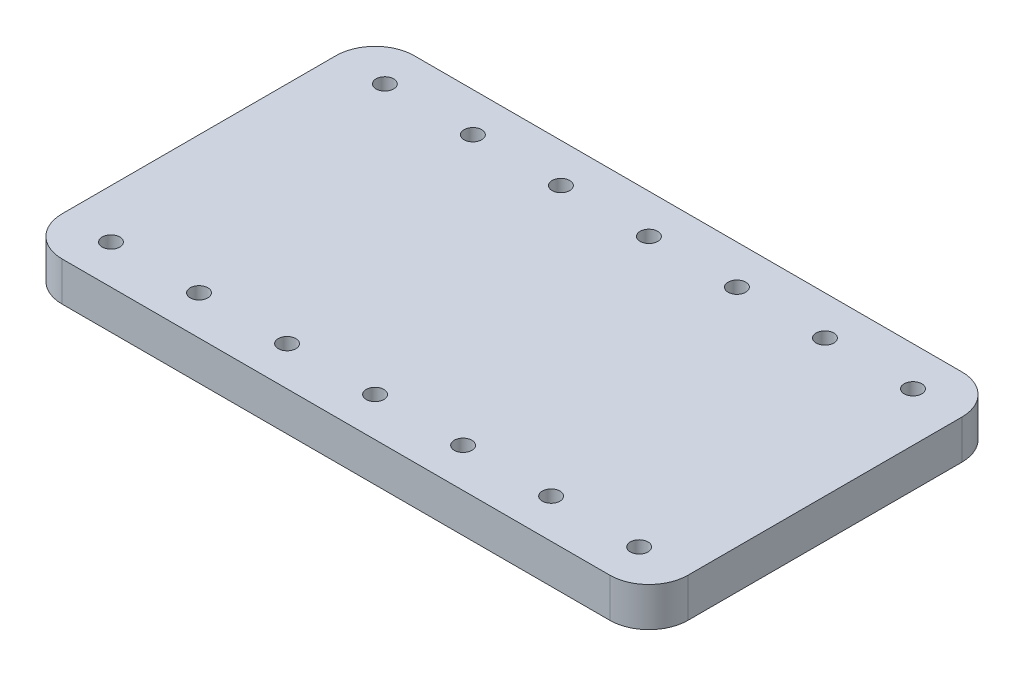
ISO-10303-21;
HEADER;
FILE_DESCRIPTION(('STEP AP214'),'2;1');
FILE_NAME('part.step','',(''),(''),'','','');
FILE_SCHEMA(('AUTOMOTIVE_DESIGN { 1 0 10303 214 1 1 1 1 }'));
ENDSEC;
DATA;
#1=APPLICATION_CONTEXT('core data for automotive mechanical design processes');
#2=APPLICATION_PROTOCOL_DEFINITION('international standard','automotive_design',2000,#1);
#3=PRODUCT_CONTEXT('',#1,'mechanical');
#4=PRODUCT('Part','Part','',(#3));
#5=PRODUCT_RELATED_PRODUCT_CATEGORY('part','',(#4));
#6=PRODUCT_DEFINITION_FORMATION('','',#4);
#7=PRODUCT_DEFINITION_CONTEXT('part definition',#1,'design');
#8=PRODUCT_DEFINITION('design','',#6,#7);
#9=PRODUCT_DEFINITION_SHAPE('','',#8);
#10=(LENGTH_UNIT() NAMED_UNIT(*) SI_UNIT(.MILLI.,.METRE.));
#11=(NAMED_UNIT(*) PLANE_ANGLE_UNIT() SI_UNIT($,.RADIAN.));
#12=(NAMED_UNIT(*) SI_UNIT($,.STERADIAN.) SOLID_ANGLE_UNIT());
#13=UNCERTAINTY_MEASURE_WITH_UNIT(LENGTH_MEASURE(1.E-05),#10,'distance_accuracy_value','');
#14=(GEOMETRIC_REPRESENTATION_CONTEXT(3) GLOBAL_UNCERTAINTY_ASSIGNED_CONTEXT((#13)) GLOBAL_UNIT_ASSIGNED_CONTEXT((#10,
#11,#12)) REPRESENTATION_CONTEXT('',''));
#15=CARTESIAN_POINT('',(0.,0.,0.));
#16=DIRECTION('',(0.,0.,1.));
#17=DIRECTION('',(1.,0.,0.));
#18=AXIS2_PLACEMENT_3D('',#15,#16,#17);
#19=CARTESIAN_POINT('',(0.,10.,0.));
#20=DIRECTION('',(0.,1.,0.));
#21=DIRECTION('',(0.,0.,1.));
#22=AXIS2_PLACEMENT_3D('',#19,#20,#21);
#23=PLANE('',#22);
#24=CARTESIAN_POINT('',(0.,10.,35.));
#25=DIRECTION('',(0.,1.,0.));
#26=DIRECTION('',(0.,0.,1.));
#27=AXIS2_PLACEMENT_3D('',#24,#25,#26);
#28=CIRCLE('',#27,2.25);
#29=CARTESIAN_POINT('',(0.,10.,37.25));
#30=VERTEX_POINT('',#29);
#31=EDGE_CURVE('E245',#30,#30,#28,.T.);
#32=ORIENTED_EDGE('',*,*,#31,.F.);
#33=EDGE_LOOP('',(#32));
#34=FACE_BOUND('',#33,.T.);
#35=CARTESIAN_POINT('',(0.,10.,-35.));
#36=DIRECTION('',(0.,1.,0.));
#37=DIRECTION('',(0.,0.,1.));
#38=AXIS2_PLACEMENT_3D('',#35,#36,#37);
#39=CIRCLE('',#38,2.25);
#40=CARTESIAN_POINT('',(0.,10.,-32.75));
#41=VERTEX_POINT('',#40);
#42=EDGE_CURVE('E233',#41,#41,#39,.T.);
#43=ORIENTED_EDGE('',*,*,#42,.F.);
#44=EDGE_LOOP('',(#43));
#45=FACE_BOUND('',#44,.T.);
#46=CARTESIAN_POINT('',(-45.,10.,-35.));
#47=DIRECTION('',(0.,1.,0.));
#48=DIRECTION('',(0.,0.,1.));
#49=AXIS2_PLACEMENT_3D('',#46,#47,#48);
#50=CIRCLE('',#49,2.25);
#51=CARTESIAN_POINT('',(-45.,10.,-32.75));
#52=VERTEX_POINT('',#51);
#53=EDGE_CURVE('E221',#52,#52,#50,.T.);
#54=ORIENTED_EDGE('',*,*,#53,.F.);
#55=EDGE_LOOP('',(#54));
#56=FACE_BOUND('',#55,.T.);
#57=CARTESIAN_POINT('',(-22.5,10.,35.));
#58=DIRECTION('',(0.,1.,0.));
#59=DIRECTION('',(0.,0.,1.));
#60=AXIS2_PLACEMENT_3D('',#57,#58,#59);
#61=CIRCLE('',#60,2.25);
#62=CARTESIAN_POINT('',(-22.5,10.,37.25));
#63=VERTEX_POINT('',#62);
#64=EDGE_CURVE('E209',#63,#63,#61,.T.);
#65=ORIENTED_EDGE('',*,*,#64,.F.);
#66=EDGE_LOOP('',(#65));
#67=FACE_BOUND('',#66,.T.);
#68=CARTESIAN_POINT('',(67.5,10.,35.));
#69=DIRECTION('',(0.,1.,0.));
#70=DIRECTION('',(0.,0.,1.));
#71=AXIS2_PLACEMENT_3D('',#68,#69,#70);
#72=CIRCLE('',#71,2.25);
#73=CARTESIAN_POINT('',(67.5,10.,37.25));
#74=VERTEX_POINT('',#73);
#75=EDGE_CURVE('E197',#74,#74,#72,.T.);
#76=ORIENTED_EDGE('',*,*,#75,.F.);
#77=EDGE_LOOP('',(#76));
#78=FACE_BOUND('',#77,.T.);
#79=CARTESIAN_POINT('',(22.5,10.,-35.));
#80=DIRECTION('',(0.,1.,0.));
#81=DIRECTION('',(0.,0.,1.));
#82=AXIS2_PLACEMENT_3D('',#79,#80,#81);
#83=CIRCLE('',#82,2.25);
#84=CARTESIAN_POINT('',(22.5,10.,-32.75));
#85=VERTEX_POINT('',#84);
#86=EDGE_CURVE('E185',#85,#85,#83,.T.);
#87=ORIENTED_EDGE('',*,*,#86,.F.);
#88=EDGE_LOOP('',(#87));
#89=FACE_BOUND('',#88,.T.);
#90=CARTESIAN_POINT('',(-22.5,10.,-35.));
#91=DIRECTION('',(0.,1.,0.));
#92=DIRECTION('',(0.,0.,1.));
#93=AXIS2_PLACEMENT_3D('',#90,#91,#92);
#94=CIRCLE('',#93,2.25);
#95=CARTESIAN_POINT('',(-22.5,10.,-32.75));
#96=VERTEX_POINT('',#95);
#97=EDGE_CURVE('E126',#96,#96,#94,.T.);
#98=ORIENTED_EDGE('',*,*,#97,.F.);
#99=EDGE_LOOP('',(#98));
#100=FACE_BOUND('',#99,.T.);
#101=DIRECTION('',(-1.,0.,0.));
#102=VECTOR('',#101,1.);
#103=CARTESIAN_POINT('',(-80.,10.,-45.));
#104=LINE('',#103,#102);
#105=CARTESIAN_POINT('',(70.,10.,-45.));
#106=VERTEX_POINT('',#105);
#107=CARTESIAN_POINT('',(-70.,10.,-45.));
#108=VERTEX_POINT('',#107);
#109=EDGE_CURVE('E135',#106,#108,#104,.T.);
#110=ORIENTED_EDGE('',*,*,#109,.T.);
#111=CARTESIAN_POINT('',(-70.,10.,-35.));
#112=DIRECTION('',(0.,1.,0.));
#113=DIRECTION('',(0.,0.,1.));
#114=AXIS2_PLACEMENT_3D('',#111,#112,#113);
#115=CIRCLE('',#114,10.);
#116=CARTESIAN_POINT('',(-80.,10.,-35.));
#117=VERTEX_POINT('',#116);
#118=EDGE_CURVE('E154',#108,#117,#115,.T.);
#119=ORIENTED_EDGE('',*,*,#118,.T.);
#120=DIRECTION('',(0.,0.,1.));
#121=VECTOR('',#120,1.);
#122=CARTESIAN_POINT('',(-80.,10.,-45.));
#123=LINE('',#122,#121);
#124=CARTESIAN_POINT('',(-80.,10.,35.));
#125=VERTEX_POINT('',#124);
#126=EDGE_CURVE('E118',#117,#125,#123,.T.);
#127=ORIENTED_EDGE('',*,*,#126,.T.);
#128=CARTESIAN_POINT('',(-70.,10.,35.));
#129=DIRECTION('',(0.,1.,0.));
#130=DIRECTION('',(0.,0.,1.));
#131=AXIS2_PLACEMENT_3D('',#128,#129,#130);
#132=CIRCLE('',#131,10.);
#133=CARTESIAN_POINT('',(-70.,10.,45.));
#134=VERTEX_POINT('',#133);
#135=EDGE_CURVE('E149',#125,#134,#132,.T.);
#136=ORIENTED_EDGE('',*,*,#135,.T.);
#137=DIRECTION('',(1.,0.,0.));
#138=VECTOR('',#137,1.);
#139=CARTESIAN_POINT('',(-80.,10.,45.));
#140=LINE('',#139,#138);
#141=CARTESIAN_POINT('',(70.,10.,45.));
#142=VERTEX_POINT('',#141);
#143=EDGE_CURVE('E165',#134,#142,#140,.T.);
#144=ORIENTED_EDGE('',*,*,#143,.T.);
#145=CARTESIAN_POINT('',(70.,10.,35.));
#146=DIRECTION('',(0.,1.,0.));
#147=DIRECTION('',(0.,0.,1.));
#148=AXIS2_PLACEMENT_3D('',#145,#146,#147);
#149=CIRCLE('',#148,10.);
#150=CARTESIAN_POINT('',(80.,10.,34.9999999999999));
#151=VERTEX_POINT('',#150);
#152=EDGE_CURVE('E54',#142,#151,#149,.T.);
#153=ORIENTED_EDGE('',*,*,#152,.T.);
#154=DIRECTION('',(0.,0.,-1.));
#155=VECTOR('',#154,1.);
#156=CARTESIAN_POINT('',(80.,10.,-45.));
#157=LINE('',#156,#155);
#158=CARTESIAN_POINT('',(80.,10.,-35.));
#159=VERTEX_POINT('',#158);
#160=EDGE_CURVE('E173',#151,#159,#157,.T.);
#161=ORIENTED_EDGE('',*,*,#160,.T.);
#162=CARTESIAN_POINT('',(70.,10.,-35.));
#163=DIRECTION('',(0.,1.,0.));
#164=DIRECTION('',(0.,0.,1.));
#165=AXIS2_PLACEMENT_3D('',#162,#163,#164);
#166=CIRCLE('',#165,10.);
#167=EDGE_CURVE('E152',#159,#106,#166,.T.);
#168=ORIENTED_EDGE('',*,*,#167,.T.);
#169=EDGE_LOOP('',(#110,#119,#127,#136,#144,#153,#161,#168));
#170=FACE_BOUND('',#169,.T.);
#171=CARTESIAN_POINT('',(-67.5,10.,-35.));
#172=DIRECTION('',(0.,1.,0.));
#173=DIRECTION('',(0.,0.,1.));
#174=AXIS2_PLACEMENT_3D('',#171,#172,#173);
#175=CIRCLE('',#174,2.25);
#176=CARTESIAN_POINT('',(-67.5,10.,-32.75));
#177=VERTEX_POINT('',#176);
#178=EDGE_CURVE('E180',#177,#177,#175,.T.);
#179=ORIENTED_EDGE('',*,*,#178,.F.);
#180=EDGE_LOOP('',(#179));
#181=FACE_BOUND('',#180,.T.);
#182=CARTESIAN_POINT('',(67.5,10.,-35.));
#183=DIRECTION('',(0.,1.,0.));
#184=DIRECTION('',(0.,0.,1.));
#185=AXIS2_PLACEMENT_3D('',#182,#183,#184);
#186=CIRCLE('',#185,2.25);
#187=CARTESIAN_POINT('',(67.5,10.,-32.75));
#188=VERTEX_POINT('',#187);
#189=EDGE_CURVE('E191',#188,#188,#186,.T.);
#190=ORIENTED_EDGE('',*,*,#189,.F.);
#191=EDGE_LOOP('',(#190));
#192=FACE_BOUND('',#191,.T.);
#193=CARTESIAN_POINT('',(22.5,10.,35.));
#194=DIRECTION('',(0.,1.,0.));
#195=DIRECTION('',(0.,0.,1.));
#196=AXIS2_PLACEMENT_3D('',#193,#194,#195);
#197=CIRCLE('',#196,2.25);
#198=CARTESIAN_POINT('',(22.5,10.,37.25));
#199=VERTEX_POINT('',#198);
#200=EDGE_CURVE('E203',#199,#199,#197,.T.);
#201=ORIENTED_EDGE('',*,*,#200,.F.);
#202=EDGE_LOOP('',(#201));
#203=FACE_BOUND('',#202,.T.);
#204=CARTESIAN_POINT('',(-67.5,10.,35.));
#205=DIRECTION('',(0.,1.,0.));
#206=DIRECTION('',(0.,0.,1.));
#207=AXIS2_PLACEMENT_3D('',#204,#205,#206);
#208=CIRCLE('',#207,2.25);
#209=CARTESIAN_POINT('',(-67.5,10.,37.25));
#210=VERTEX_POINT('',#209);
#211=EDGE_CURVE('E215',#210,#210,#208,.T.);
#212=ORIENTED_EDGE('',*,*,#211,.F.);
#213=EDGE_LOOP('',(#212));
#214=FACE_BOUND('',#213,.T.);
#215=CARTESIAN_POINT('',(45.,10.,-35.));
#216=DIRECTION('',(0.,1.,0.));
#217=DIRECTION('',(0.,0.,1.));
#218=AXIS2_PLACEMENT_3D('',#215,#216,#217);
#219=CIRCLE('',#218,2.25);
#220=CARTESIAN_POINT('',(45.,10.,-32.75));
#221=VERTEX_POINT('',#220);
#222=EDGE_CURVE('E227',#221,#221,#219,.T.);
#223=ORIENTED_EDGE('',*,*,#222,.F.);
#224=EDGE_LOOP('',(#223));
#225=FACE_BOUND('',#224,.T.);
#226=CARTESIAN_POINT('',(-45.,10.,35.));
#227=DIRECTION('',(0.,1.,0.));
#228=DIRECTION('',(0.,0.,1.));
#229=AXIS2_PLACEMENT_3D('',#226,#227,#228);
#230=CIRCLE('',#229,2.25);
#231=CARTESIAN_POINT('',(-45.,10.,37.25));
#232=VERTEX_POINT('',#231);
#233=EDGE_CURVE('E239',#232,#232,#230,.T.);
#234=ORIENTED_EDGE('',*,*,#233,.F.);
#235=EDGE_LOOP('',(#234));
#236=FACE_BOUND('',#235,.T.);
#237=CARTESIAN_POINT('',(45.,10.,35.));
#238=DIRECTION('',(0.,1.,0.));
#239=DIRECTION('',(0.,0.,1.));
#240=AXIS2_PLACEMENT_3D('',#237,#238,#239);
#241=CIRCLE('',#240,2.25);
#242=CARTESIAN_POINT('',(45.,10.,37.25));
#243=VERTEX_POINT('',#242);
#244=EDGE_CURVE('E251',#243,#243,#241,.T.);
#245=ORIENTED_EDGE('',*,*,#244,.F.);
#246=EDGE_LOOP('',(#245));
#247=FACE_BOUND('',#246,.T.);
#248=ADVANCED_FACE('F32',(#34,#45,#56,#67,#78,#89,#100,#170,#181,#192,#203,#214,#225,#236,#247),
#23,.T.);
#249=CARTESIAN_POINT('',(0.,0.,0.));
#250=DIRECTION('',(0.,1.,0.));
#251=DIRECTION('',(0.,0.,1.));
#252=AXIS2_PLACEMENT_3D('',#249,#250,#251);
#253=PLANE('',#252);
#254=DIRECTION('',(0.,0.,1.));
#255=VECTOR('',#254,1.);
#256=CARTESIAN_POINT('',(-80.,0.,-45.));
#257=LINE('',#256,#255);
#258=CARTESIAN_POINT('',(-80.,0.,-35.));
#259=VERTEX_POINT('',#258);
#260=CARTESIAN_POINT('',(-80.,0.,35.));
#261=VERTEX_POINT('',#260);
#262=EDGE_CURVE('E115',#259,#261,#257,.T.);
#263=ORIENTED_EDGE('',*,*,#262,.F.);
#264=CARTESIAN_POINT('',(-70.,0.,-35.));
#265=DIRECTION('',(0.,1.,0.));
#266=DIRECTION('',(0.,0.,1.));
#267=AXIS2_PLACEMENT_3D('',#264,#265,#266);
#268=CIRCLE('',#267,10.);
#269=CARTESIAN_POINT('',(-70.,0.,-45.));
#270=VERTEX_POINT('',#269);
#271=EDGE_CURVE('E98',#259,#270,#268,.F.);
#272=ORIENTED_EDGE('',*,*,#271,.T.);
#273=DIRECTION('',(-1.,0.,0.));
#274=VECTOR('',#273,1.);
#275=CARTESIAN_POINT('',(-80.,0.,-45.));
#276=LINE('',#275,#274);
#277=CARTESIAN_POINT('',(70.,0.,-45.));
#278=VERTEX_POINT('',#277);
#279=EDGE_CURVE('E139',#278,#270,#276,.T.);
#280=ORIENTED_EDGE('',*,*,#279,.F.);
#281=CARTESIAN_POINT('',(70.,0.,-35.));
#282=DIRECTION('',(0.,1.,0.));
#283=DIRECTION('',(0.,0.,1.));
#284=AXIS2_PLACEMENT_3D('',#281,#282,#283);
#285=CIRCLE('',#284,10.);
#286=CARTESIAN_POINT('',(80.,0.,-35.));
#287=VERTEX_POINT('',#286);
#288=EDGE_CURVE('E109',#278,#287,#285,.F.);
#289=ORIENTED_EDGE('',*,*,#288,.T.);
#290=DIRECTION('',(0.,0.,-1.));
#291=VECTOR('',#290,1.);
#292=CARTESIAN_POINT('',(80.,0.,-45.));
#293=LINE('',#292,#291);
#294=CARTESIAN_POINT('',(80.,0.,34.9999999999999));
#295=VERTEX_POINT('',#294);
#296=EDGE_CURVE('E129',#295,#287,#293,.T.);
#297=ORIENTED_EDGE('',*,*,#296,.F.);
#298=CARTESIAN_POINT('',(70.,0.,35.));
#299=DIRECTION('',(0.,1.,0.));
#300=DIRECTION('',(0.,0.,1.));
#301=AXIS2_PLACEMENT_3D('',#298,#299,#300);
#302=CIRCLE('',#301,10.);
#303=CARTESIAN_POINT('',(70.,0.,45.));
#304=VERTEX_POINT('',#303);
#305=EDGE_CURVE('E143',#295,#304,#302,.F.);
#306=ORIENTED_EDGE('',*,*,#305,.T.);
#307=DIRECTION('',(1.,0.,0.));
#308=VECTOR('',#307,1.);
#309=CARTESIAN_POINT('',(-80.,0.,45.));
#310=LINE('',#309,#308);
#311=CARTESIAN_POINT('',(-70.,0.,45.));
#312=VERTEX_POINT('',#311);
#313=EDGE_CURVE('E125',#312,#304,#310,.T.);
#314=ORIENTED_EDGE('',*,*,#313,.F.);
#315=CARTESIAN_POINT('',(-70.,0.,35.));
#316=DIRECTION('',(0.,1.,0.));
#317=DIRECTION('',(0.,0.,1.));
#318=AXIS2_PLACEMENT_3D('',#315,#316,#317);
#319=CIRCLE('',#318,10.);
#320=EDGE_CURVE('E119',#312,#261,#319,.F.);
#321=ORIENTED_EDGE('',*,*,#320,.T.);
#322=EDGE_LOOP('',(#263,#272,#280,#289,#297,#306,#314,#321));
#323=FACE_BOUND('',#322,.T.);
#324=CARTESIAN_POINT('',(-22.5,0.,-35.));
#325=DIRECTION('',(0.,1.,0.));
#326=DIRECTION('',(0.,0.,1.));
#327=AXIS2_PLACEMENT_3D('',#324,#325,#326);
#328=CIRCLE('',#327,2.25);
#329=CARTESIAN_POINT('',(-22.5,0.,-32.75));
#330=VERTEX_POINT('',#329);
#331=EDGE_CURVE('E132',#330,#330,#328,.T.);
#332=ORIENTED_EDGE('',*,*,#331,.T.);
#333=EDGE_LOOP('',(#332));
#334=FACE_BOUND('',#333,.T.);
#335=CARTESIAN_POINT('',(-67.5,0.,-35.));
#336=DIRECTION('',(0.,1.,0.));
#337=DIRECTION('',(0.,0.,1.));
#338=AXIS2_PLACEMENT_3D('',#335,#336,#337);
#339=CIRCLE('',#338,2.25);
#340=CARTESIAN_POINT('',(-67.5,0.,-32.75));
#341=VERTEX_POINT('',#340);
#342=EDGE_CURVE('E182',#341,#341,#339,.T.);
#343=ORIENTED_EDGE('',*,*,#342,.T.);
#344=EDGE_LOOP('',(#343));
#345=FACE_BOUND('',#344,.T.);
#346=CARTESIAN_POINT('',(22.5,0.,-35.));
#347=DIRECTION('',(0.,1.,0.));
#348=DIRECTION('',(0.,0.,1.));
#349=AXIS2_PLACEMENT_3D('',#346,#347,#348);
#350=CIRCLE('',#349,2.25);
#351=CARTESIAN_POINT('',(22.5,0.,-32.75));
#352=VERTEX_POINT('',#351);
#353=EDGE_CURVE('E188',#352,#352,#350,.T.);
#354=ORIENTED_EDGE('',*,*,#353,.T.);
#355=EDGE_LOOP('',(#354));
#356=FACE_BOUND('',#355,.T.);
#357=CARTESIAN_POINT('',(67.5,0.,-35.));
#358=DIRECTION('',(0.,1.,0.));
#359=DIRECTION('',(0.,0.,1.));
#360=AXIS2_PLACEMENT_3D('',#357,#358,#359);
#361=CIRCLE('',#360,2.25);
#362=CARTESIAN_POINT('',(67.5,0.,-32.75));
#363=VERTEX_POINT('',#362);
#364=EDGE_CURVE('E194',#363,#363,#361,.T.);
#365=ORIENTED_EDGE('',*,*,#364,.T.);
#366=EDGE_LOOP('',(#365));
#367=FACE_BOUND('',#366,.T.);
#368=CARTESIAN_POINT('',(67.5,0.,35.));
#369=DIRECTION('',(0.,1.,0.));
#370=DIRECTION('',(0.,0.,1.));
#371=AXIS2_PLACEMENT_3D('',#368,#369,#370);
#372=CIRCLE('',#371,2.25);
#373=CARTESIAN_POINT('',(67.5,0.,37.25));
#374=VERTEX_POINT('',#373);
#375=EDGE_CURVE('E200',#374,#374,#372,.T.);
#376=ORIENTED_EDGE('',*,*,#375,.T.);
#377=EDGE_LOOP('',(#376));
#378=FACE_BOUND('',#377,.T.);
#379=CARTESIAN_POINT('',(22.5,0.,35.));
#380=DIRECTION('',(0.,1.,0.));
#381=DIRECTION('',(0.,0.,1.));
#382=AXIS2_PLACEMENT_3D('',#379,#380,#381);
#383=CIRCLE('',#382,2.25);
#384=CARTESIAN_POINT('',(22.5,0.,37.25));
#385=VERTEX_POINT('',#384);
#386=EDGE_CURVE('E206',#385,#385,#383,.T.);
#387=ORIENTED_EDGE('',*,*,#386,.T.);
#388=EDGE_LOOP('',(#387));
#389=FACE_BOUND('',#388,.T.);
#390=CARTESIAN_POINT('',(-22.5,0.,35.));
#391=DIRECTION('',(0.,1.,0.));
#392=DIRECTION('',(0.,0.,1.));
#393=AXIS2_PLACEMENT_3D('',#390,#391,#392);
#394=CIRCLE('',#393,2.25);
#395=CARTESIAN_POINT('',(-22.5,0.,37.25));
#396=VERTEX_POINT('',#395);
#397=EDGE_CURVE('E212',#396,#396,#394,.T.);
#398=ORIENTED_EDGE('',*,*,#397,.T.);
#399=EDGE_LOOP('',(#398));
#400=FACE_BOUND('',#399,.T.);
#401=CARTESIAN_POINT('',(-67.5,0.,35.));
#402=DIRECTION('',(0.,1.,0.));
#403=DIRECTION('',(0.,0.,1.));
#404=AXIS2_PLACEMENT_3D('',#401,#402,#403);
#405=CIRCLE('',#404,2.25);
#406=CARTESIAN_POINT('',(-67.5,0.,37.25));
#407=VERTEX_POINT('',#406);
#408=EDGE_CURVE('E218',#407,#407,#405,.T.);
#409=ORIENTED_EDGE('',*,*,#408,.T.);
#410=EDGE_LOOP('',(#409));
#411=FACE_BOUND('',#410,.T.);
#412=CARTESIAN_POINT('',(-45.,0.,-35.));
#413=DIRECTION('',(0.,1.,0.));
#414=DIRECTION('',(0.,0.,1.));
#415=AXIS2_PLACEMENT_3D('',#412,#413,#414);
#416=CIRCLE('',#415,2.25);
#417=CARTESIAN_POINT('',(-45.,0.,-32.75));
#418=VERTEX_POINT('',#417);
#419=EDGE_CURVE('E224',#418,#418,#416,.T.);
#420=ORIENTED_EDGE('',*,*,#419,.T.);
#421=EDGE_LOOP('',(#420));
#422=FACE_BOUND('',#421,.T.);
#423=CARTESIAN_POINT('',(45.,0.,-35.));
#424=DIRECTION('',(0.,1.,0.));
#425=DIRECTION('',(0.,0.,1.));
#426=AXIS2_PLACEMENT_3D('',#423,#424,#425);
#427=CIRCLE('',#426,2.25);
#428=CARTESIAN_POINT('',(45.,0.,-32.75));
#429=VERTEX_POINT('',#428);
#430=EDGE_CURVE('E230',#429,#429,#427,.T.);
#431=ORIENTED_EDGE('',*,*,#430,.T.);
#432=EDGE_LOOP('',(#431));
#433=FACE_BOUND('',#432,.T.);
#434=CARTESIAN_POINT('',(0.,0.,-35.));
#435=DIRECTION('',(0.,1.,0.));
#436=DIRECTION('',(0.,0.,1.));
#437=AXIS2_PLACEMENT_3D('',#434,#435,#436);
#438=CIRCLE('',#437,2.25);
#439=CARTESIAN_POINT('',(0.,0.,-32.75));
#440=VERTEX_POINT('',#439);
#441=EDGE_CURVE('E236',#440,#440,#438,.T.);
#442=ORIENTED_EDGE('',*,*,#441,.T.);
#443=EDGE_LOOP('',(#442));
#444=FACE_BOUND('',#443,.T.);
#445=CARTESIAN_POINT('',(-45.,0.,35.));
#446=DIRECTION('',(0.,1.,0.));
#447=DIRECTION('',(0.,0.,1.));
#448=AXIS2_PLACEMENT_3D('',#445,#446,#447);
#449=CIRCLE('',#448,2.25);
#450=CARTESIAN_POINT('',(-45.,0.,37.25));
#451=VERTEX_POINT('',#450);
#452=EDGE_CURVE('E242',#451,#451,#449,.T.);
#453=ORIENTED_EDGE('',*,*,#452,.T.);
#454=EDGE_LOOP('',(#453));
#455=FACE_BOUND('',#454,.T.);
#456=CARTESIAN_POINT('',(0.,0.,35.));
#457=DIRECTION('',(0.,1.,0.));
#458=DIRECTION('',(0.,0.,1.));
#459=AXIS2_PLACEMENT_3D('',#456,#457,#458);
#460=CIRCLE('',#459,2.25);
#461=CARTESIAN_POINT('',(0.,0.,37.25));
#462=VERTEX_POINT('',#461);
#463=EDGE_CURVE('E248',#462,#462,#460,.T.);
#464=ORIENTED_EDGE('',*,*,#463,.T.);
#465=EDGE_LOOP('',(#464));
#466=FACE_BOUND('',#465,.T.);
#467=CARTESIAN_POINT('',(45.,0.,35.));
#468=DIRECTION('',(0.,1.,0.));
#469=DIRECTION('',(0.,0.,1.));
#470=AXIS2_PLACEMENT_3D('',#467,#468,#469);
#471=CIRCLE('',#470,2.25);
#472=CARTESIAN_POINT('',(45.,0.,37.25));
#473=VERTEX_POINT('',#472);
#474=EDGE_CURVE('E254',#473,#473,#471,.T.);
#475=ORIENTED_EDGE('',*,*,#474,.T.);
#476=EDGE_LOOP('',(#475));
#477=FACE_BOUND('',#476,.T.);
#478=ADVANCED_FACE('F122',(#323,#334,#345,#356,#367,#378,#389,#400,#411,#422,#433,#444,#455,
#466,#477),#253,.F.);
#479=CARTESIAN_POINT('',(-80.,10.,-45.));
#480=DIRECTION('',(1.,0.,0.));
#481=DIRECTION('',(0.,0.,-1.));
#482=AXIS2_PLACEMENT_3D('',#479,#480,#481);
#483=PLANE('',#482);
#484=ORIENTED_EDGE('',*,*,#126,.F.);
#485=DIRECTION('',(0.,-1.,0.));
#486=VECTOR('',#485,1.);
#487=CARTESIAN_POINT('',(-80.,10.,-35.));
#488=LINE('',#487,#486);
#489=EDGE_CURVE('E102',#117,#259,#488,.T.);
#490=ORIENTED_EDGE('',*,*,#489,.T.);
#491=ORIENTED_EDGE('',*,*,#262,.T.);
#492=DIRECTION('',(0.,-1.,0.));
#493=VECTOR('',#492,1.);
#494=CARTESIAN_POINT('',(-80.,10.,35.));
#495=LINE('',#494,#493);
#496=EDGE_CURVE('E120',#261,#125,#495,.F.);
#497=ORIENTED_EDGE('',*,*,#496,.T.);
#498=EDGE_LOOP('',(#484,#490,#491,#497));
#499=FACE_BOUND('',#498,.T.);
#500=ADVANCED_FACE('F114',(#499),#483,.F.);
#501=CARTESIAN_POINT('',(-80.,10.,45.));
#502=DIRECTION('',(0.,0.,-1.));
#503=DIRECTION('',(-1.,0.,0.));
#504=AXIS2_PLACEMENT_3D('',#501,#502,#503);
#505=PLANE('',#504);
#506=ORIENTED_EDGE('',*,*,#313,.T.);
#507=DIRECTION('',(0.,-1.,0.));
#508=VECTOR('',#507,1.);
#509=CARTESIAN_POINT('',(70.0000000000001,10.,45.));
#510=LINE('',#509,#508);
#511=EDGE_CURVE('E11',#304,#142,#510,.F.);
#512=ORIENTED_EDGE('',*,*,#511,.T.);
#513=ORIENTED_EDGE('',*,*,#143,.F.);
#514=DIRECTION('',(0.,-1.,0.));
#515=VECTOR('',#514,1.);
#516=CARTESIAN_POINT('',(-70.,10.,45.));
#517=LINE('',#516,#515);
#518=EDGE_CURVE('E40',#134,#312,#517,.T.);
#519=ORIENTED_EDGE('',*,*,#518,.T.);
#520=EDGE_LOOP('',(#506,#512,#513,#519));
#521=FACE_BOUND('',#520,.T.);
#522=ADVANCED_FACE('F163',(#521),#505,.F.);
#523=CARTESIAN_POINT('',(80.,10.,-45.));
#524=DIRECTION('',(-1.,0.,0.));
#525=DIRECTION('',(0.,0.,1.));
#526=AXIS2_PLACEMENT_3D('',#523,#524,#525);
#527=PLANE('',#526);
#528=ORIENTED_EDGE('',*,*,#296,.T.);
#529=DIRECTION('',(0.,-1.,0.));
#530=VECTOR('',#529,1.);
#531=CARTESIAN_POINT('',(80.,10.,-35.));
#532=LINE('',#531,#530);
#533=EDGE_CURVE('E47',#287,#159,#532,.F.);
#534=ORIENTED_EDGE('',*,*,#533,.T.);
#535=ORIENTED_EDGE('',*,*,#160,.F.);
#536=DIRECTION('',(0.,-1.,0.));
#537=VECTOR('',#536,1.);
#538=CARTESIAN_POINT('',(80.,10.,35.));
#539=LINE('',#538,#537);
#540=EDGE_CURVE('E156',#151,#295,#539,.T.);
#541=ORIENTED_EDGE('',*,*,#540,.T.);
#542=EDGE_LOOP('',(#528,#534,#535,#541));
#543=FACE_BOUND('',#542,.T.);
#544=ADVANCED_FACE('F172',(#543),#527,.F.);
#545=CARTESIAN_POINT('',(-80.,10.,-45.));
#546=DIRECTION('',(0.,0.,1.));
#547=DIRECTION('',(1.,0.,0.));
#548=AXIS2_PLACEMENT_3D('',#545,#546,#547);
#549=PLANE('',#548);
#550=ORIENTED_EDGE('',*,*,#279,.T.);
#551=DIRECTION('',(0.,-1.,0.));
#552=VECTOR('',#551,1.);
#553=CARTESIAN_POINT('',(-70.,10.,-45.));
#554=LINE('',#553,#552);
#555=EDGE_CURVE('E103',#270,#108,#554,.F.);
#556=ORIENTED_EDGE('',*,*,#555,.T.);
#557=ORIENTED_EDGE('',*,*,#109,.F.);
#558=DIRECTION('',(0.,-1.,0.));
#559=VECTOR('',#558,1.);
#560=CARTESIAN_POINT('',(70.,10.,-45.));
#561=LINE('',#560,#559);
#562=EDGE_CURVE('E108',#106,#278,#561,.T.);
#563=ORIENTED_EDGE('',*,*,#562,.T.);
#564=EDGE_LOOP('',(#550,#556,#557,#563));
#565=FACE_BOUND('',#564,.T.);
#566=ADVANCED_FACE('F276',(#565),#549,.F.);
#567=CARTESIAN_POINT('',(-22.5,10.,-35.));
#568=DIRECTION('',(0.,-1.,0.));
#569=DIRECTION('',(0.,0.,-1.));
#570=AXIS2_PLACEMENT_3D('',#567,#568,#569);
#571=CYLINDRICAL_SURFACE('',#570,2.25);
#572=ORIENTED_EDGE('',*,*,#97,.T.);
#573=EDGE_LOOP('',(#572));
#574=FACE_BOUND('',#573,.T.);
#575=ORIENTED_EDGE('',*,*,#331,.F.);
#576=EDGE_LOOP('',(#575));
#577=FACE_BOUND('',#576,.T.);
#578=ADVANCED_FACE('F273',(#574,#577),#571,.F.);
#579=CARTESIAN_POINT('',(-67.5,10.,-35.));
#580=DIRECTION('',(0.,-1.,0.));
#581=DIRECTION('',(0.,0.,-1.));
#582=AXIS2_PLACEMENT_3D('',#579,#580,#581);
#583=CYLINDRICAL_SURFACE('',#582,2.25);
#584=ORIENTED_EDGE('',*,*,#178,.T.);
#585=EDGE_LOOP('',(#584));
#586=FACE_BOUND('',#585,.T.);
#587=ORIENTED_EDGE('',*,*,#342,.F.);
#588=EDGE_LOOP('',(#587));
#589=FACE_BOUND('',#588,.T.);
#590=ADVANCED_FACE('F365',(#586,#589),#583,.F.);
#591=CARTESIAN_POINT('',(22.5,10.,-35.));
#592=DIRECTION('',(0.,-1.,0.));
#593=DIRECTION('',(0.,0.,-1.));
#594=AXIS2_PLACEMENT_3D('',#591,#592,#593);
#595=CYLINDRICAL_SURFACE('',#594,2.25);
#596=ORIENTED_EDGE('',*,*,#86,.T.);
#597=EDGE_LOOP('',(#596));
#598=FACE_BOUND('',#597,.T.);
#599=ORIENTED_EDGE('',*,*,#353,.F.);
#600=EDGE_LOOP('',(#599));
#601=FACE_BOUND('',#600,.T.);
#602=ADVANCED_FACE('F362',(#598,#601),#595,.F.);
#603=CARTESIAN_POINT('',(67.5,10.,-35.));
#604=DIRECTION('',(0.,-1.,0.));
#605=DIRECTION('',(0.,0.,-1.));
#606=AXIS2_PLACEMENT_3D('',#603,#604,#605);
#607=CYLINDRICAL_SURFACE('',#606,2.25);
#608=ORIENTED_EDGE('',*,*,#189,.T.);
#609=EDGE_LOOP('',(#608));
#610=FACE_BOUND('',#609,.T.);
#611=ORIENTED_EDGE('',*,*,#364,.F.);
#612=EDGE_LOOP('',(#611));
#613=FACE_BOUND('',#612,.T.);
#614=ADVANCED_FACE('F358',(#610,#613),#607,.F.);
#615=CARTESIAN_POINT('',(67.5,10.,35.));
#616=DIRECTION('',(0.,-1.,0.));
#617=DIRECTION('',(0.,0.,-1.));
#618=AXIS2_PLACEMENT_3D('',#615,#616,#617);
#619=CYLINDRICAL_SURFACE('',#618,2.25);
#620=ORIENTED_EDGE('',*,*,#75,.T.);
#621=EDGE_LOOP('',(#620));
#622=FACE_BOUND('',#621,.T.);
#623=ORIENTED_EDGE('',*,*,#375,.F.);
#624=EDGE_LOOP('',(#623));
#625=FACE_BOUND('',#624,.T.);
#626=ADVANCED_FACE('F354',(#622,#625),#619,.F.);
#627=CARTESIAN_POINT('',(22.5,10.,35.));
#628=DIRECTION('',(0.,-1.,0.));
#629=DIRECTION('',(0.,0.,-1.));
#630=AXIS2_PLACEMENT_3D('',#627,#628,#629);
#631=CYLINDRICAL_SURFACE('',#630,2.25);
#632=ORIENTED_EDGE('',*,*,#200,.T.);
#633=EDGE_LOOP('',(#632));
#634=FACE_BOUND('',#633,.T.);
#635=ORIENTED_EDGE('',*,*,#386,.F.);
#636=EDGE_LOOP('',(#635));
#637=FACE_BOUND('',#636,.T.);
#638=ADVANCED_FACE('F350',(#634,#637),#631,.F.);
#639=CARTESIAN_POINT('',(-22.5,10.,35.));
#640=DIRECTION('',(0.,-1.,0.));
#641=DIRECTION('',(0.,0.,-1.));
#642=AXIS2_PLACEMENT_3D('',#639,#640,#641);
#643=CYLINDRICAL_SURFACE('',#642,2.25);
#644=ORIENTED_EDGE('',*,*,#64,.T.);
#645=EDGE_LOOP('',(#644));
#646=FACE_BOUND('',#645,.T.);
#647=ORIENTED_EDGE('',*,*,#397,.F.);
#648=EDGE_LOOP('',(#647));
#649=FACE_BOUND('',#648,.T.);
#650=ADVANCED_FACE('F346',(#646,#649),#643,.F.);
#651=CARTESIAN_POINT('',(-67.5,10.,35.));
#652=DIRECTION('',(0.,-1.,0.));
#653=DIRECTION('',(0.,0.,-1.));
#654=AXIS2_PLACEMENT_3D('',#651,#652,#653);
#655=CYLINDRICAL_SURFACE('',#654,2.25);
#656=ORIENTED_EDGE('',*,*,#211,.T.);
#657=EDGE_LOOP('',(#656));
#658=FACE_BOUND('',#657,.T.);
#659=ORIENTED_EDGE('',*,*,#408,.F.);
#660=EDGE_LOOP('',(#659));
#661=FACE_BOUND('',#660,.T.);
#662=ADVANCED_FACE('F342',(#658,#661),#655,.F.);
#663=CARTESIAN_POINT('',(-45.,10.,-35.));
#664=DIRECTION('',(0.,-1.,0.));
#665=DIRECTION('',(0.,0.,-1.));
#666=AXIS2_PLACEMENT_3D('',#663,#664,#665);
#667=CYLINDRICAL_SURFACE('',#666,2.25);
#668=ORIENTED_EDGE('',*,*,#53,.T.);
#669=EDGE_LOOP('',(#668));
#670=FACE_BOUND('',#669,.T.);
#671=ORIENTED_EDGE('',*,*,#419,.F.);
#672=EDGE_LOOP('',(#671));
#673=FACE_BOUND('',#672,.T.);
#674=ADVANCED_FACE('F338',(#670,#673),#667,.F.);
#675=CARTESIAN_POINT('',(45.,10.,-35.));
#676=DIRECTION('',(0.,-1.,0.));
#677=DIRECTION('',(0.,0.,-1.));
#678=AXIS2_PLACEMENT_3D('',#675,#676,#677);
#679=CYLINDRICAL_SURFACE('',#678,2.25);
#680=ORIENTED_EDGE('',*,*,#222,.T.);
#681=EDGE_LOOP('',(#680));
#682=FACE_BOUND('',#681,.T.);
#683=ORIENTED_EDGE('',*,*,#430,.F.);
#684=EDGE_LOOP('',(#683));
#685=FACE_BOUND('',#684,.T.);
#686=ADVANCED_FACE('F334',(#682,#685),#679,.F.);
#687=CARTESIAN_POINT('',(0.,10.,-35.));
#688=DIRECTION('',(0.,-1.,0.));
#689=DIRECTION('',(0.,0.,-1.));
#690=AXIS2_PLACEMENT_3D('',#687,#688,#689);
#691=CYLINDRICAL_SURFACE('',#690,2.25);
#692=ORIENTED_EDGE('',*,*,#42,.T.);
#693=EDGE_LOOP('',(#692));
#694=FACE_BOUND('',#693,.T.);
#695=ORIENTED_EDGE('',*,*,#441,.F.);
#696=EDGE_LOOP('',(#695));
#697=FACE_BOUND('',#696,.T.);
#698=ADVANCED_FACE('F316',(#694,#697),#691,.F.);
#699=CARTESIAN_POINT('',(-45.,10.,35.));
#700=DIRECTION('',(0.,-1.,0.));
#701=DIRECTION('',(0.,0.,-1.));
#702=AXIS2_PLACEMENT_3D('',#699,#700,#701);
#703=CYLINDRICAL_SURFACE('',#702,2.25);
#704=ORIENTED_EDGE('',*,*,#233,.T.);
#705=EDGE_LOOP('',(#704));
#706=FACE_BOUND('',#705,.T.);
#707=ORIENTED_EDGE('',*,*,#452,.F.);
#708=EDGE_LOOP('',(#707));
#709=FACE_BOUND('',#708,.T.);
#710=ADVANCED_FACE('F312',(#706,#709),#703,.F.);
#711=CARTESIAN_POINT('',(0.,10.,35.));
#712=DIRECTION('',(0.,-1.,0.));
#713=DIRECTION('',(0.,0.,-1.));
#714=AXIS2_PLACEMENT_3D('',#711,#712,#713);
#715=CYLINDRICAL_SURFACE('',#714,2.25);
#716=ORIENTED_EDGE('',*,*,#31,.T.);
#717=EDGE_LOOP('',(#716));
#718=FACE_BOUND('',#717,.T.);
#719=ORIENTED_EDGE('',*,*,#463,.F.);
#720=EDGE_LOOP('',(#719));
#721=FACE_BOUND('',#720,.T.);
#722=ADVANCED_FACE('F315',(#718,#721),#715,.F.);
#723=CARTESIAN_POINT('',(45.,10.,35.));
#724=DIRECTION('',(0.,-1.,0.));
#725=DIRECTION('',(0.,0.,-1.));
#726=AXIS2_PLACEMENT_3D('',#723,#724,#725);
#727=CYLINDRICAL_SURFACE('',#726,2.25);
#728=ORIENTED_EDGE('',*,*,#244,.T.);
#729=EDGE_LOOP('',(#728));
#730=FACE_BOUND('',#729,.T.);
#731=ORIENTED_EDGE('',*,*,#474,.F.);
#732=EDGE_LOOP('',(#731));
#733=FACE_BOUND('',#732,.T.);
#734=ADVANCED_FACE('F260',(#730,#733),#727,.F.);
#735=CARTESIAN_POINT('',(-70.,10.,-35.));
#736=DIRECTION('',(0.,-1.,0.));
#737=DIRECTION('',(0.,0.,-1.));
#738=AXIS2_PLACEMENT_3D('',#735,#736,#737);
#739=CYLINDRICAL_SURFACE('',#738,10.);
#740=ORIENTED_EDGE('',*,*,#118,.F.);
#741=ORIENTED_EDGE('',*,*,#555,.F.);
#742=ORIENTED_EDGE('',*,*,#271,.F.);
#743=ORIENTED_EDGE('',*,*,#489,.F.);
#744=EDGE_LOOP('',(#740,#741,#742,#743));
#745=FACE_BOUND('',#744,.T.);
#746=ADVANCED_FACE('F101',(#745),#739,.T.);
#747=CARTESIAN_POINT('',(70.,10.,-35.));
#748=DIRECTION('',(0.,-1.,0.));
#749=DIRECTION('',(0.,0.,-1.));
#750=AXIS2_PLACEMENT_3D('',#747,#748,#749);
#751=CYLINDRICAL_SURFACE('',#750,10.);
#752=ORIENTED_EDGE('',*,*,#167,.F.);
#753=ORIENTED_EDGE('',*,*,#533,.F.);
#754=ORIENTED_EDGE('',*,*,#288,.F.);
#755=ORIENTED_EDGE('',*,*,#562,.F.);
#756=EDGE_LOOP('',(#752,#753,#754,#755));
#757=FACE_BOUND('',#756,.T.);
#758=ADVANCED_FACE('F288',(#757),#751,.T.);
#759=CARTESIAN_POINT('',(70.,10.,35.));
#760=DIRECTION('',(0.,-1.,0.));
#761=DIRECTION('',(0.,0.,-1.));
#762=AXIS2_PLACEMENT_3D('',#759,#760,#761);
#763=CYLINDRICAL_SURFACE('',#762,10.);
#764=ORIENTED_EDGE('',*,*,#152,.F.);
#765=ORIENTED_EDGE('',*,*,#511,.F.);
#766=ORIENTED_EDGE('',*,*,#305,.F.);
#767=ORIENTED_EDGE('',*,*,#540,.F.);
#768=EDGE_LOOP('',(#764,#765,#766,#767));
#769=FACE_BOUND('',#768,.T.);
#770=ADVANCED_FACE('F171',(#769),#763,.T.);
#771=CARTESIAN_POINT('',(-70.,10.,35.));
#772=DIRECTION('',(0.,-1.,0.));
#773=DIRECTION('',(0.,0.,-1.));
#774=AXIS2_PLACEMENT_3D('',#771,#772,#773);
#775=CYLINDRICAL_SURFACE('',#774,10.);
#776=ORIENTED_EDGE('',*,*,#135,.F.);
#777=ORIENTED_EDGE('',*,*,#496,.F.);
#778=ORIENTED_EDGE('',*,*,#320,.F.);
#779=ORIENTED_EDGE('',*,*,#518,.F.);
#780=EDGE_LOOP('',(#776,#777,#778,#779));
#781=FACE_BOUND('',#780,.T.);
#782=ADVANCED_FACE('F34',(#781),#775,.T.);
#783=CLOSED_SHELL('',(#248,#478,#500,#522,#544,#566,#578,#590,#602,#614,#626,#638,#650,#662,
#674,#686,#698,#710,#722,#734,#746,#758,#770,#782));
#784=MANIFOLD_SOLID_BREP('B2',#783);
#785=ADVANCED_BREP_SHAPE_REPRESENTATION('',(#18,#784),#14);
#786=SHAPE_DEFINITION_REPRESENTATION(#9,#785);
ENDSEC;
END-ISO-10303-21;
